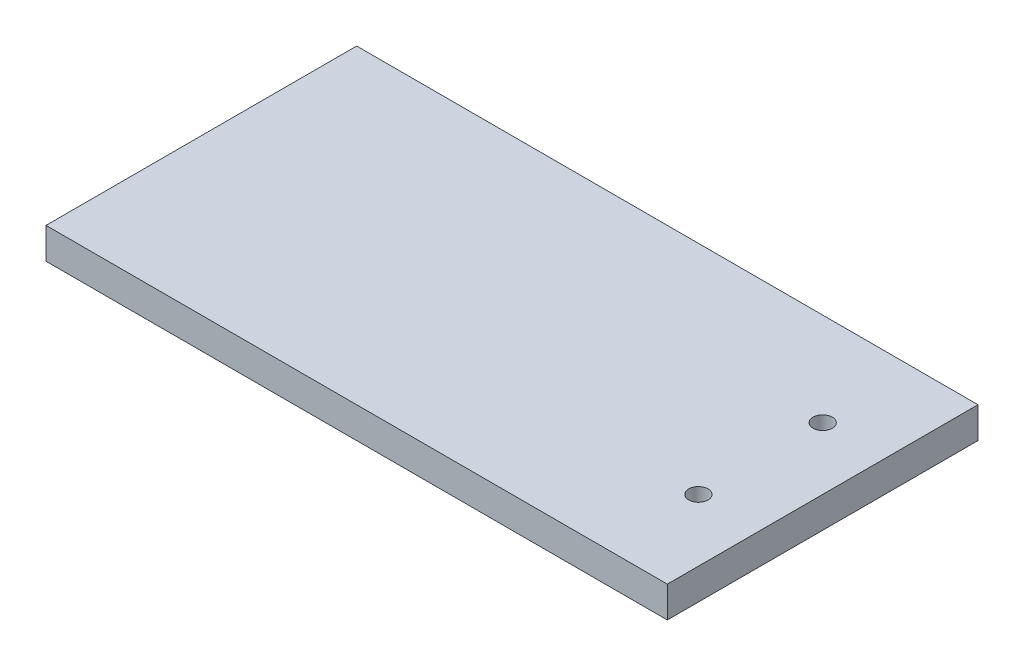
ISO-10303-21;
HEADER;
FILE_DESCRIPTION(('STEP AP214'),'2;1');
FILE_NAME('part.step','',(''),(''),'','','');
FILE_SCHEMA(('AUTOMOTIVE_DESIGN { 1 0 10303 214 1 1 1 1 }'));
ENDSEC;
DATA;
#1=APPLICATION_CONTEXT('core data for automotive mechanical design processes');
#2=APPLICATION_PROTOCOL_DEFINITION('international standard','automotive_design',2000,#1);
#3=PRODUCT_CONTEXT('',#1,'mechanical');
#4=PRODUCT('Part','Part','',(#3));
#5=PRODUCT_RELATED_PRODUCT_CATEGORY('part','',(#4));
#6=PRODUCT_DEFINITION_FORMATION('','',#4);
#7=PRODUCT_DEFINITION_CONTEXT('part definition',#1,'design');
#8=PRODUCT_DEFINITION('design','',#6,#7);
#9=PRODUCT_DEFINITION_SHAPE('','',#8);
#10=(LENGTH_UNIT() NAMED_UNIT(*) SI_UNIT(.MILLI.,.METRE.));
#11=(NAMED_UNIT(*) PLANE_ANGLE_UNIT() SI_UNIT($,.RADIAN.));
#12=(NAMED_UNIT(*) SI_UNIT($,.STERADIAN.) SOLID_ANGLE_UNIT());
#13=UNCERTAINTY_MEASURE_WITH_UNIT(LENGTH_MEASURE(1.E-05),#10,'distance_accuracy_value','');
#14=(GEOMETRIC_REPRESENTATION_CONTEXT(3) GLOBAL_UNCERTAINTY_ASSIGNED_CONTEXT((#13)) GLOBAL_UNIT_ASSIGNED_CONTEXT((#10,
#11,#12)) REPRESENTATION_CONTEXT('',''));
#15=CARTESIAN_POINT('',(0.,0.,0.));
#16=DIRECTION('',(0.,0.,1.));
#17=DIRECTION('',(1.,0.,0.));
#18=AXIS2_PLACEMENT_3D('',#15,#16,#17);
#19=CARTESIAN_POINT('',(100.,10.,-50.));
#20=DIRECTION('',(-1.,0.,0.));
#21=DIRECTION('',(0.,0.,1.));
#22=AXIS2_PLACEMENT_3D('',#19,#20,#21);
#23=PLANE('',#22);
#24=DIRECTION('',(0.,0.,-1.));
#25=VECTOR('',#24,1.);
#26=CARTESIAN_POINT('',(100.,0.,-50.));
#27=LINE('',#26,#25);
#28=CARTESIAN_POINT('',(100.,0.,50.));
#29=VERTEX_POINT('',#28);
#30=CARTESIAN_POINT('',(100.,0.,-50.));
#31=VERTEX_POINT('',#30);
#32=EDGE_CURVE('E98',#29,#31,#27,.T.);
#33=ORIENTED_EDGE('',*,*,#32,.T.);
#34=DIRECTION('',(0.,-1.,0.));
#35=VECTOR('',#34,1.);
#36=CARTESIAN_POINT('',(100.,10.,-50.));
#37=LINE('',#36,#35);
#38=CARTESIAN_POINT('',(100.,10.,-50.));
#39=VERTEX_POINT('',#38);
#40=EDGE_CURVE('E11',#39,#31,#37,.T.);
#41=ORIENTED_EDGE('',*,*,#40,.F.);
#42=DIRECTION('',(0.,0.,-1.));
#43=VECTOR('',#42,1.);
#44=CARTESIAN_POINT('',(100.,10.,-50.));
#45=LINE('',#44,#43);
#46=CARTESIAN_POINT('',(100.,10.,50.));
#47=VERTEX_POINT('',#46);
#48=EDGE_CURVE('E86',#47,#39,#45,.T.);
#49=ORIENTED_EDGE('',*,*,#48,.F.);
#50=DIRECTION('',(0.,-1.,0.));
#51=VECTOR('',#50,1.);
#52=CARTESIAN_POINT('',(100.,10.,50.));
#53=LINE('',#52,#51);
#54=EDGE_CURVE('E94',#47,#29,#53,.T.);
#55=ORIENTED_EDGE('',*,*,#54,.T.);
#56=EDGE_LOOP('',(#33,#41,#49,#55));
#57=FACE_BOUND('',#56,.T.);
#58=ADVANCED_FACE('F35',(#57),#23,.F.);
#59=CARTESIAN_POINT('',(-100.,10.,-50.));
#60=DIRECTION('',(0.,0.,1.));
#61=DIRECTION('',(1.,0.,0.));
#62=AXIS2_PLACEMENT_3D('',#59,#60,#61);
#63=PLANE('',#62);
#64=DIRECTION('',(-1.,0.,0.));
#65=VECTOR('',#64,1.);
#66=CARTESIAN_POINT('',(-100.,0.,-50.));
#67=LINE('',#66,#65);
#68=CARTESIAN_POINT('',(-100.,0.,-50.));
#69=VERTEX_POINT('',#68);
#70=EDGE_CURVE('E90',#31,#69,#67,.T.);
#71=ORIENTED_EDGE('',*,*,#70,.T.);
#72=DIRECTION('',(0.,-1.,0.));
#73=VECTOR('',#72,1.);
#74=CARTESIAN_POINT('',(-100.,10.,-50.));
#75=LINE('',#74,#73);
#76=CARTESIAN_POINT('',(-100.,10.,-50.));
#77=VERTEX_POINT('',#76);
#78=EDGE_CURVE('E43',#77,#69,#75,.T.);
#79=ORIENTED_EDGE('',*,*,#78,.F.);
#80=DIRECTION('',(-1.,0.,0.));
#81=VECTOR('',#80,1.);
#82=CARTESIAN_POINT('',(-100.,10.,-50.));
#83=LINE('',#82,#81);
#84=EDGE_CURVE('E81',#39,#77,#83,.T.);
#85=ORIENTED_EDGE('',*,*,#84,.F.);
#86=ORIENTED_EDGE('',*,*,#40,.T.);
#87=EDGE_LOOP('',(#71,#79,#85,#86));
#88=FACE_BOUND('',#87,.T.);
#89=ADVANCED_FACE('F89',(#88),#63,.F.);
#90=CARTESIAN_POINT('',(-100.,10.,-50.));
#91=DIRECTION('',(1.,0.,0.));
#92=DIRECTION('',(0.,0.,-1.));
#93=AXIS2_PLACEMENT_3D('',#90,#91,#92);
#94=PLANE('',#93);
#95=DIRECTION('',(0.,0.,1.));
#96=VECTOR('',#95,1.);
#97=CARTESIAN_POINT('',(-100.,0.,-50.));
#98=LINE('',#97,#96);
#99=CARTESIAN_POINT('',(-100.,0.,50.));
#100=VERTEX_POINT('',#99);
#101=EDGE_CURVE('E68',#69,#100,#98,.T.);
#102=ORIENTED_EDGE('',*,*,#101,.T.);
#103=DIRECTION('',(0.,-1.,0.));
#104=VECTOR('',#103,1.);
#105=CARTESIAN_POINT('',(-100.,10.,50.));
#106=LINE('',#105,#104);
#107=CARTESIAN_POINT('',(-100.,10.,50.));
#108=VERTEX_POINT('',#107);
#109=EDGE_CURVE('E91',#108,#100,#106,.T.);
#110=ORIENTED_EDGE('',*,*,#109,.F.);
#111=DIRECTION('',(0.,0.,1.));
#112=VECTOR('',#111,1.);
#113=CARTESIAN_POINT('',(-100.,10.,-50.));
#114=LINE('',#113,#112);
#115=EDGE_CURVE('E84',#77,#108,#114,.T.);
#116=ORIENTED_EDGE('',*,*,#115,.F.);
#117=ORIENTED_EDGE('',*,*,#78,.T.);
#118=EDGE_LOOP('',(#102,#110,#116,#117));
#119=FACE_BOUND('',#118,.T.);
#120=ADVANCED_FACE('F92',(#119),#94,.F.);
#121=CARTESIAN_POINT('',(-100.,10.,50.));
#122=DIRECTION('',(0.,0.,-1.));
#123=DIRECTION('',(-1.,0.,0.));
#124=AXIS2_PLACEMENT_3D('',#121,#122,#123);
#125=PLANE('',#124);
#126=DIRECTION('',(1.,0.,0.));
#127=VECTOR('',#126,1.);
#128=CARTESIAN_POINT('',(-100.,0.,50.));
#129=LINE('',#128,#127);
#130=EDGE_CURVE('E74',#100,#29,#129,.T.);
#131=ORIENTED_EDGE('',*,*,#130,.T.);
#132=ORIENTED_EDGE('',*,*,#54,.F.);
#133=DIRECTION('',(1.,0.,0.));
#134=VECTOR('',#133,1.);
#135=CARTESIAN_POINT('',(-100.,10.,50.));
#136=LINE('',#135,#134);
#137=EDGE_CURVE('E51',#108,#47,#136,.T.);
#138=ORIENTED_EDGE('',*,*,#137,.F.);
#139=ORIENTED_EDGE('',*,*,#109,.T.);
#140=EDGE_LOOP('',(#131,#132,#138,#139));
#141=FACE_BOUND('',#140,.T.);
#142=ADVANCED_FACE('F106',(#141),#125,.F.);
#143=CARTESIAN_POINT('',(0.,10.,0.));
#144=DIRECTION('',(0.,1.,0.));
#145=DIRECTION('',(0.,0.,1.));
#146=AXIS2_PLACEMENT_3D('',#143,#144,#145);
#147=PLANE('',#146);
#148=CARTESIAN_POINT('',(80.,10.,-20.));
#149=DIRECTION('',(0.,-1.,0.));
#150=DIRECTION('',(0.,0.,-1.));
#151=AXIS2_PLACEMENT_3D('',#148,#149,#150);
#152=CIRCLE('',#151,3.09999999999999);
#153=CARTESIAN_POINT('',(80.,10.,-23.1));
#154=VERTEX_POINT('',#153);
#155=EDGE_CURVE('E120',#154,#154,#152,.T.);
#156=ORIENTED_EDGE('',*,*,#155,.T.);
#157=EDGE_LOOP('',(#156));
#158=FACE_BOUND('',#157,.T.);
#159=CARTESIAN_POINT('',(80.,10.,20.));
#160=DIRECTION('',(0.,-1.,0.));
#161=DIRECTION('',(0.,0.,-1.));
#162=AXIS2_PLACEMENT_3D('',#159,#160,#161);
#163=CIRCLE('',#162,3.09999999999999);
#164=CARTESIAN_POINT('',(80.,10.,16.9));
#165=VERTEX_POINT('',#164);
#166=EDGE_CURVE('E101',#165,#165,#163,.T.);
#167=ORIENTED_EDGE('',*,*,#166,.T.);
#168=EDGE_LOOP('',(#167));
#169=FACE_BOUND('',#168,.T.);
#170=ORIENTED_EDGE('',*,*,#48,.T.);
#171=ORIENTED_EDGE('',*,*,#84,.T.);
#172=ORIENTED_EDGE('',*,*,#115,.T.);
#173=ORIENTED_EDGE('',*,*,#137,.T.);
#174=EDGE_LOOP('',(#170,#171,#172,#173));
#175=FACE_BOUND('',#174,.T.);
#176=ADVANCED_FACE('F82',(#158,#169,#175),#147,.T.);
#177=CARTESIAN_POINT('',(0.,0.,0.));
#178=DIRECTION('',(0.,1.,0.));
#179=DIRECTION('',(0.,0.,1.));
#180=AXIS2_PLACEMENT_3D('',#177,#178,#179);
#181=PLANE('',#180);
#182=CARTESIAN_POINT('',(80.,0.,-20.));
#183=DIRECTION('',(0.,-1.,0.));
#184=DIRECTION('',(0.,0.,-1.));
#185=AXIS2_PLACEMENT_3D('',#182,#183,#184);
#186=CIRCLE('',#185,6.3);
#187=CARTESIAN_POINT('',(80.,0.,-26.3));
#188=VERTEX_POINT('',#187);
#189=EDGE_CURVE('E126',#188,#188,#186,.T.);
#190=ORIENTED_EDGE('',*,*,#189,.F.);
#191=EDGE_LOOP('',(#190));
#192=FACE_BOUND('',#191,.T.);
#193=CARTESIAN_POINT('',(80.,0.,20.));
#194=DIRECTION('',(0.,-1.,0.));
#195=DIRECTION('',(0.,0.,-1.));
#196=AXIS2_PLACEMENT_3D('',#193,#194,#195);
#197=CIRCLE('',#196,6.3);
#198=CARTESIAN_POINT('',(80.,0.,13.7));
#199=VERTEX_POINT('',#198);
#200=EDGE_CURVE('E117',#199,#199,#197,.T.);
#201=ORIENTED_EDGE('',*,*,#200,.F.);
#202=EDGE_LOOP('',(#201));
#203=FACE_BOUND('',#202,.T.);
#204=ORIENTED_EDGE('',*,*,#32,.F.);
#205=ORIENTED_EDGE('',*,*,#130,.F.);
#206=ORIENTED_EDGE('',*,*,#101,.F.);
#207=ORIENTED_EDGE('',*,*,#70,.F.);
#208=EDGE_LOOP('',(#204,#205,#206,#207));
#209=FACE_BOUND('',#208,.T.);
#210=ADVANCED_FACE('F109',(#192,#203,#209),#181,.F.);
#211=CARTESIAN_POINT('',(80.,0.,20.));
#212=DIRECTION('',(0.,-1.,0.));
#213=DIRECTION('',(0.,0.,-1.));
#214=AXIS2_PLACEMENT_3D('',#211,#212,#213);
#215=CYLINDRICAL_SURFACE('',#214,3.09999999999999);
#216=ORIENTED_EDGE('',*,*,#166,.F.);
#217=EDGE_LOOP('',(#216));
#218=FACE_BOUND('',#217,.T.);
#219=CARTESIAN_POINT('',(80.,3.2,20.));
#220=DIRECTION('',(0.,-1.,0.));
#221=DIRECTION('',(0.,0.,-1.));
#222=AXIS2_PLACEMENT_3D('',#219,#220,#221);
#223=CIRCLE('',#222,3.09999999999999);
#224=CARTESIAN_POINT('',(80.,3.2,16.9));
#225=VERTEX_POINT('',#224);
#226=EDGE_CURVE('E114',#225,#225,#223,.T.);
#227=ORIENTED_EDGE('',*,*,#226,.T.);
#228=EDGE_LOOP('',(#227));
#229=FACE_BOUND('',#228,.T.);
#230=ADVANCED_FACE('F134',(#218,#229),#215,.F.);
#231=CARTESIAN_POINT('',(80.,0.,20.));
#232=DIRECTION('',(0.,-1.,0.));
#233=DIRECTION('',(0.,0.,-1.));
#234=AXIS2_PLACEMENT_3D('',#231,#232,#233);
#235=CONICAL_SURFACE('',#234,6.3,0.785398163397449);
#236=ORIENTED_EDGE('',*,*,#226,.F.);
#237=EDGE_LOOP('',(#236));
#238=FACE_BOUND('',#237,.T.);
#239=ORIENTED_EDGE('',*,*,#200,.T.);
#240=EDGE_LOOP('',(#239));
#241=FACE_BOUND('',#240,.T.);
#242=ADVANCED_FACE('F138',(#238,#241),#235,.F.);
#243=CARTESIAN_POINT('',(80.,0.,-20.));
#244=DIRECTION('',(0.,-1.,0.));
#245=DIRECTION('',(0.,0.,-1.));
#246=AXIS2_PLACEMENT_3D('',#243,#244,#245);
#247=CYLINDRICAL_SURFACE('',#246,3.09999999999999);
#248=ORIENTED_EDGE('',*,*,#155,.F.);
#249=EDGE_LOOP('',(#248));
#250=FACE_BOUND('',#249,.T.);
#251=CARTESIAN_POINT('',(80.,3.2,-20.));
#252=DIRECTION('',(0.,-1.,0.));
#253=DIRECTION('',(0.,0.,-1.));
#254=AXIS2_PLACEMENT_3D('',#251,#252,#253);
#255=CIRCLE('',#254,3.09999999999999);
#256=CARTESIAN_POINT('',(80.,3.2,-23.1));
#257=VERTEX_POINT('',#256);
#258=EDGE_CURVE('E123',#257,#257,#255,.T.);
#259=ORIENTED_EDGE('',*,*,#258,.T.);
#260=EDGE_LOOP('',(#259));
#261=FACE_BOUND('',#260,.T.);
#262=ADVANCED_FACE('F140',(#250,#261),#247,.F.);
#263=CARTESIAN_POINT('',(80.,0.,-20.));
#264=DIRECTION('',(0.,-1.,0.));
#265=DIRECTION('',(0.,0.,-1.));
#266=AXIS2_PLACEMENT_3D('',#263,#264,#265);
#267=CONICAL_SURFACE('',#266,6.3,0.785398163397449);
#268=ORIENTED_EDGE('',*,*,#258,.F.);
#269=EDGE_LOOP('',(#268));
#270=FACE_BOUND('',#269,.T.);
#271=ORIENTED_EDGE('',*,*,#189,.T.);
#272=EDGE_LOOP('',(#271));
#273=FACE_BOUND('',#272,.T.);
#274=ADVANCED_FACE('F130',(#270,#273),#267,.F.);
#275=CLOSED_SHELL('',(#58,#89,#120,#142,#176,#210,#230,#242,#262,#274));
#276=MANIFOLD_SOLID_BREP('B2',#275);
#277=ADVANCED_BREP_SHAPE_REPRESENTATION('',(#18,#276),#14);
#278=SHAPE_DEFINITION_REPRESENTATION(#9,#277);
ENDSEC;
END-ISO-10303-21;
